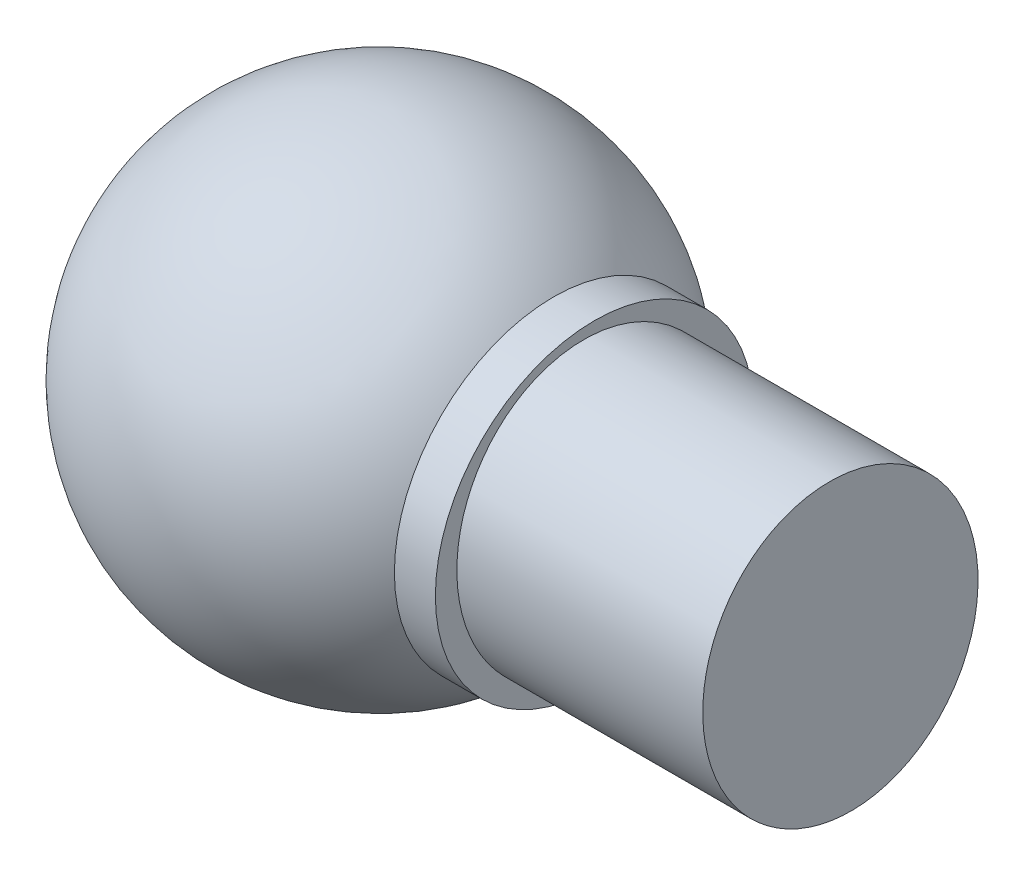
ISO-10303-21;
HEADER;
FILE_DESCRIPTION(('STEP AP214'),'2;1');
FILE_NAME('part.step','',(''),(''),'','','');
FILE_SCHEMA(('AUTOMOTIVE_DESIGN { 1 0 10303 214 1 1 1 1 }'));
ENDSEC;
DATA;
#1=APPLICATION_CONTEXT('core data for automotive mechanical design processes');
#2=APPLICATION_PROTOCOL_DEFINITION('international standard','automotive_design',2000,#1);
#3=PRODUCT_CONTEXT('',#1,'mechanical');
#4=PRODUCT('Part','Part','',(#3));
#5=PRODUCT_RELATED_PRODUCT_CATEGORY('part','',(#4));
#6=PRODUCT_DEFINITION_FORMATION('','',#4);
#7=PRODUCT_DEFINITION_CONTEXT('part definition',#1,'design');
#8=PRODUCT_DEFINITION('design','',#6,#7);
#9=PRODUCT_DEFINITION_SHAPE('','',#8);
#10=(LENGTH_UNIT() NAMED_UNIT(*) SI_UNIT(.MILLI.,.METRE.));
#11=(NAMED_UNIT(*) PLANE_ANGLE_UNIT() SI_UNIT($,.RADIAN.));
#12=(NAMED_UNIT(*) SI_UNIT($,.STERADIAN.) SOLID_ANGLE_UNIT());
#13=UNCERTAINTY_MEASURE_WITH_UNIT(LENGTH_MEASURE(1.E-05),#10,'distance_accuracy_value','');
#14=(GEOMETRIC_REPRESENTATION_CONTEXT(3) GLOBAL_UNCERTAINTY_ASSIGNED_CONTEXT((#13)) GLOBAL_UNIT_ASSIGNED_CONTEXT((#10,
#11,#12)) REPRESENTATION_CONTEXT('',''));
#15=CARTESIAN_POINT('',(0.,0.,0.));
#16=DIRECTION('',(0.,0.,1.));
#17=DIRECTION('',(1.,0.,0.));
#18=AXIS2_PLACEMENT_3D('',#15,#16,#17);
#19=CARTESIAN_POINT('',(-3.,-5.17694696722693,-12.0792389764325));
#20=DIRECTION('',(-1.,0.,0.));
#21=DIRECTION('',(0.,0.917226045230669,0.398367144667463));
#22=AXIS2_PLACEMENT_3D('',#19,#20,#21);
#23=ELLIPSE('',#22,1.83432270993306,1.64818157560468);
#24=DIRECTION('',(1.,0.,0.));
#25=VECTOR('',#24,1.);
#26=SURFACE_OF_LINEAR_EXTRUSION('',#23,#25);
#27=CARTESIAN_POINT('',(-3.,-3.49445840231822,-11.3485050760778));
#28=VERTEX_POINT('',#27);
#29=EDGE_CURVE('E10',#28,#28,#23,.T.);
#30=ORIENTED_EDGE('',*,*,#29,.F.);
#31=EDGE_LOOP('',(#30));
#32=FACE_BOUND('',#31,.T.);
#33=CARTESIAN_POINT('',(0.,-5.17694696722693,-12.0792389764325));
#34=DIRECTION('',(-1.,0.,0.));
#35=DIRECTION('',(0.,0.917226045230669,0.398367144667463));
#36=AXIS2_PLACEMENT_3D('',#33,#34,#35);
#37=ELLIPSE('',#36,1.83432270993306,1.64818157560468);
#38=CARTESIAN_POINT('',(0.,-3.49445840231822,-11.3485050760778));
#39=VERTEX_POINT('',#38);
#40=EDGE_CURVE('E65',#39,#39,#37,.T.);
#41=ORIENTED_EDGE('',*,*,#40,.T.);
#42=EDGE_LOOP('',(#41));
#43=FACE_BOUND('',#42,.T.);
#44=ADVANCED_FACE('F33',(#32,#43),#26,.F.);
#45=CARTESIAN_POINT('',(-3.5,-5.17694696722693,-12.0792389764325));
#46=DIRECTION('',(1.,0.,0.));
#47=DIRECTION('',(0.,0.,-1.));
#48=AXIS2_PLACEMENT_3D('',#45,#46,#47);
#49=CYLINDRICAL_SURFACE('',#48,1.94140372408132);
#50=CARTESIAN_POINT('',(-3.5,-5.17694696722693,-12.0792389764325));
#51=DIRECTION('',(-1.,0.,0.));
#52=DIRECTION('',(0.,0.,1.));
#53=AXIS2_PLACEMENT_3D('',#50,#51,#52);
#54=CIRCLE('',#53,1.94140372408132);
#55=CARTESIAN_POINT('',(-3.5,-5.17694696722693,-10.1378352523512));
#56=VERTEX_POINT('',#55);
#57=EDGE_CURVE('E37',#56,#56,#54,.T.);
#58=ORIENTED_EDGE('',*,*,#57,.F.);
#59=EDGE_LOOP('',(#58));
#60=FACE_BOUND('',#59,.T.);
#61=CARTESIAN_POINT('',(-3.,-5.17694696722693,-12.0792389764325));
#62=DIRECTION('',(-1.,0.,0.));
#63=DIRECTION('',(0.,0.,1.));
#64=AXIS2_PLACEMENT_3D('',#61,#62,#63);
#65=CIRCLE('',#64,1.94140372408132);
#66=CARTESIAN_POINT('',(-3.,-5.17694696722693,-10.1378352523512));
#67=VERTEX_POINT('',#66);
#68=EDGE_CURVE('E44',#67,#67,#65,.T.);
#69=ORIENTED_EDGE('',*,*,#68,.T.);
#70=EDGE_LOOP('',(#69));
#71=FACE_BOUND('',#70,.T.);
#72=ADVANCED_FACE('F50',(#60,#71),#49,.T.);
#73=CARTESIAN_POINT('',(-5.62309515801232,-5.17694696722693,-12.0792389764325));
#74=DIRECTION('',(0.,0.,1.));
#75=DIRECTION('',(1.,0.,0.));
#76=AXIS2_PLACEMENT_3D('',#73,#74,#75);
#77=SPHERICAL_SURFACE('',#76,2.87690484198768);
#78=CARTESIAN_POINT('',(-5.62309515801232,-5.17694696722693,-12.0792389764325));
#79=DIRECTION('',(-1.,0.,0.));
#80=DIRECTION('',(0.,0.,1.));
#81=AXIS2_PLACEMENT_3D('',#78,#79,#80);
#82=SPHERICAL_SURFACE('',#81,2.87690484198768);
#83=ORIENTED_EDGE('',*,*,#57,.T.);
#84=EDGE_LOOP('',(#83));
#85=FACE_BOUND('',#84,.T.);
#86=ADVANCED_FACE('F35',(#85),#82,.T.);
#87=CARTESIAN_POINT('',(-3.,-5.17694696722693,-12.0792389764325));
#88=DIRECTION('',(-1.,0.,0.));
#89=DIRECTION('',(0.,0.,1.));
#90=AXIS2_PLACEMENT_3D('',#87,#88,#89);
#91=PLANE('',#90);
#92=ORIENTED_EDGE('',*,*,#29,.T.);
#93=EDGE_LOOP('',(#92));
#94=FACE_BOUND('',#93,.T.);
#95=ORIENTED_EDGE('',*,*,#68,.F.);
#96=EDGE_LOOP('',(#95));
#97=FACE_BOUND('',#96,.T.);
#98=ADVANCED_FACE('F55',(#94,#97),#91,.F.);
#99=CARTESIAN_POINT('',(0.,-28.0179977370023,-2.33751784389769));
#100=DIRECTION('',(-1.,0.,0.));
#101=DIRECTION('',(0.,0.,1.));
#102=AXIS2_PLACEMENT_3D('',#99,#100,#101);
#103=PLANE('',#102);
#104=ORIENTED_EDGE('',*,*,#40,.F.);
#105=EDGE_LOOP('',(#104));
#106=FACE_BOUND('',#105,.T.);
#107=ADVANCED_FACE('F58',(#106),#103,.F.);
#108=CLOSED_SHELL('',(#44,#72,#86,#98,#107));
#109=MANIFOLD_SOLID_BREP('B2',#108);
#110=ADVANCED_BREP_SHAPE_REPRESENTATION('',(#18,#109),#14);
#111=SHAPE_DEFINITION_REPRESENTATION(#9,#110);
ENDSEC;
END-ISO-10303-21;
